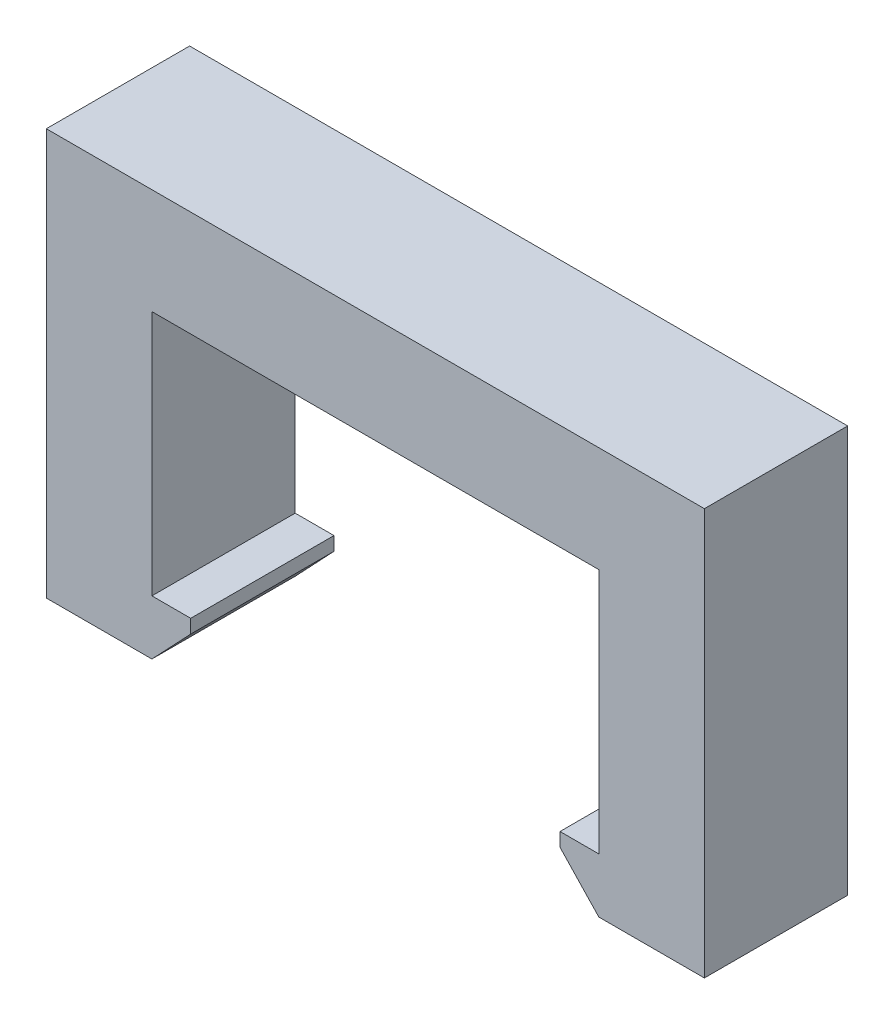
ISO-10303-21;
HEADER;
FILE_DESCRIPTION(('STEP AP214'),'2;1');
FILE_NAME('part.step','',(''),(''),'','','');
FILE_SCHEMA(('AUTOMOTIVE_DESIGN { 1 0 10303 214 1 1 1 1 }'));
ENDSEC;
DATA;
#1=APPLICATION_CONTEXT('core data for automotive mechanical design processes');
#2=APPLICATION_PROTOCOL_DEFINITION('international standard','automotive_design',2000,#1);
#3=PRODUCT_CONTEXT('',#1,'mechanical');
#4=PRODUCT('Part','Part','',(#3));
#5=PRODUCT_RELATED_PRODUCT_CATEGORY('part','',(#4));
#6=PRODUCT_DEFINITION_FORMATION('','',#4);
#7=PRODUCT_DEFINITION_CONTEXT('part definition',#1,'design');
#8=PRODUCT_DEFINITION('design','',#6,#7);
#9=PRODUCT_DEFINITION_SHAPE('','',#8);
#10=(LENGTH_UNIT() NAMED_UNIT(*) SI_UNIT(.MILLI.,.METRE.));
#11=(NAMED_UNIT(*) PLANE_ANGLE_UNIT() SI_UNIT($,.RADIAN.));
#12=(NAMED_UNIT(*) SI_UNIT($,.STERADIAN.) SOLID_ANGLE_UNIT());
#13=UNCERTAINTY_MEASURE_WITH_UNIT(LENGTH_MEASURE(1.E-05),#10,'distance_accuracy_value','');
#14=(GEOMETRIC_REPRESENTATION_CONTEXT(3) GLOBAL_UNCERTAINTY_ASSIGNED_CONTEXT((#13)) GLOBAL_UNIT_ASSIGNED_CONTEXT((#10,
#11,#12)) REPRESENTATION_CONTEXT('',''));
#15=CARTESIAN_POINT('',(0.,0.,0.));
#16=DIRECTION('',(0.,0.,1.));
#17=DIRECTION('',(1.,0.,0.));
#18=AXIS2_PLACEMENT_3D('',#15,#16,#17);
#19=CARTESIAN_POINT('',(0.,0.,12.8016));
#20=DIRECTION('',(0.,-1.,0.));
#21=DIRECTION('',(1.,0.,0.));
#22=AXIS2_PLACEMENT_3D('',#19,#20,#21);
#23=PLANE('',#22);
#24=DIRECTION('',(-1.,0.,0.));
#25=VECTOR('',#24,1.);
#26=CARTESIAN_POINT('',(0.,0.,0.));
#27=LINE('',#26,#25);
#28=CARTESIAN_POINT('',(29.3969610679769,0.,0.));
#29=VERTEX_POINT('',#28);
#30=CARTESIAN_POINT('',(-29.3969610679769,0.,0.));
#31=VERTEX_POINT('',#30);
#32=EDGE_CURVE('E107',#29,#31,#27,.T.);
#33=ORIENTED_EDGE('',*,*,#32,.T.);
#34=DIRECTION('',(0.,0.,-1.));
#35=VECTOR('',#34,1.);
#36=CARTESIAN_POINT('',(-29.3969610679769,0.,12.8016));
#37=LINE('',#36,#35);
#38=CARTESIAN_POINT('',(-29.3969610679769,0.,12.8016));
#39=VERTEX_POINT('',#38);
#40=EDGE_CURVE('E11',#39,#31,#37,.T.);
#41=ORIENTED_EDGE('',*,*,#40,.F.);
#42=DIRECTION('',(-1.,0.,0.));
#43=VECTOR('',#42,1.);
#44=CARTESIAN_POINT('',(0.,0.,12.8016));
#45=LINE('',#44,#43);
#46=CARTESIAN_POINT('',(29.3969610679769,0.,12.8016));
#47=VERTEX_POINT('',#46);
#48=EDGE_CURVE('E114',#47,#39,#45,.T.);
#49=ORIENTED_EDGE('',*,*,#48,.F.);
#50=DIRECTION('',(0.,0.,-1.));
#51=VECTOR('',#50,1.);
#52=CARTESIAN_POINT('',(29.3969610679769,0.,12.8016));
#53=LINE('',#52,#51);
#54=EDGE_CURVE('E170',#47,#29,#53,.T.);
#55=ORIENTED_EDGE('',*,*,#54,.T.);
#56=EDGE_LOOP('',(#33,#41,#49,#55));
#57=FACE_BOUND('',#56,.T.);
#58=ADVANCED_FACE('F39',(#57),#23,.F.);
#59=CARTESIAN_POINT('',(-29.3969610679769,0.,12.8016));
#60=DIRECTION('',(1.,0.,0.));
#61=DIRECTION('',(0.,1.,0.));
#62=AXIS2_PLACEMENT_3D('',#59,#60,#61);
#63=PLANE('',#62);
#64=DIRECTION('',(0.,-1.,0.));
#65=VECTOR('',#64,1.);
#66=CARTESIAN_POINT('',(-29.3969610679769,0.,0.));
#67=LINE('',#66,#65);
#68=CARTESIAN_POINT('',(-29.3969610679769,-36.3153120844734,0.));
#69=VERTEX_POINT('',#68);
#70=EDGE_CURVE('E175',#31,#69,#67,.T.);
#71=ORIENTED_EDGE('',*,*,#70,.T.);
#72=DIRECTION('',(0.,0.,-1.));
#73=VECTOR('',#72,1.);
#74=CARTESIAN_POINT('',(-29.3969610679769,-36.3153120844734,12.8016));
#75=LINE('',#74,#73);
#76=CARTESIAN_POINT('',(-29.3969610679769,-36.3153120844734,12.8016));
#77=VERTEX_POINT('',#76);
#78=EDGE_CURVE('E50',#77,#69,#75,.T.);
#79=ORIENTED_EDGE('',*,*,#78,.F.);
#80=DIRECTION('',(0.,-1.,0.));
#81=VECTOR('',#80,1.);
#82=CARTESIAN_POINT('',(-29.3969610679769,0.,12.8016));
#83=LINE('',#82,#81);
#84=EDGE_CURVE('E274',#39,#77,#83,.T.);
#85=ORIENTED_EDGE('',*,*,#84,.F.);
#86=ORIENTED_EDGE('',*,*,#40,.T.);
#87=EDGE_LOOP('',(#71,#79,#85,#86));
#88=FACE_BOUND('',#87,.T.);
#89=ADVANCED_FACE('F280',(#88),#63,.F.);
#90=CARTESIAN_POINT('',(-29.3969610679769,-36.3153120844734,12.8016));
#91=DIRECTION('',(0.,1.,0.));
#92=DIRECTION('',(0.,0.,1.));
#93=AXIS2_PLACEMENT_3D('',#90,#91,#92);
#94=PLANE('',#93);
#95=DIRECTION('',(1.,0.,0.));
#96=VECTOR('',#95,1.);
#97=CARTESIAN_POINT('',(-29.3969610679769,-36.3153120844734,0.));
#98=LINE('',#97,#96);
#99=CARTESIAN_POINT('',(-19.9644,-36.3153120844734,0.));
#100=VERTEX_POINT('',#99);
#101=EDGE_CURVE('E172',#69,#100,#98,.T.);
#102=ORIENTED_EDGE('',*,*,#101,.T.);
#103=DIRECTION('',(0.,0.,-1.));
#104=VECTOR('',#103,1.);
#105=CARTESIAN_POINT('',(-19.9644,-36.3153120844734,12.8016));
#106=LINE('',#105,#104);
#107=CARTESIAN_POINT('',(-19.9644,-36.3153120844734,12.8016));
#108=VERTEX_POINT('',#107);
#109=EDGE_CURVE('E222',#108,#100,#106,.T.);
#110=ORIENTED_EDGE('',*,*,#109,.F.);
#111=DIRECTION('',(1.,0.,0.));
#112=VECTOR('',#111,1.);
#113=CARTESIAN_POINT('',(-29.3969610679769,-36.3153120844734,12.8016));
#114=LINE('',#113,#112);
#115=EDGE_CURVE('E229',#77,#108,#114,.T.);
#116=ORIENTED_EDGE('',*,*,#115,.F.);
#117=ORIENTED_EDGE('',*,*,#78,.T.);
#118=EDGE_LOOP('',(#102,#110,#116,#117));
#119=FACE_BOUND('',#118,.T.);
#120=ADVANCED_FACE('F226',(#119),#94,.F.);
#121=CARTESIAN_POINT('',(-19.9644,-36.3153120844734,12.8016));
#122=DIRECTION('',(-0.726425661410117,0.68724504977837,0.));
#123=DIRECTION('',(-0.68724504977837,-0.726425661410117,0.));
#124=AXIS2_PLACEMENT_3D('',#121,#122,#123);
#125=PLANE('',#124);
#126=DIRECTION('',(0.68724504977837,0.726425661410117,0.));
#127=VECTOR('',#126,1.);
#128=CARTESIAN_POINT('',(-19.9644,-36.3153120844734,0.));
#129=LINE('',#128,#127);
#130=CARTESIAN_POINT('',(-16.4973,-32.650548822101,0.));
#131=VERTEX_POINT('',#130);
#132=EDGE_CURVE('E176',#100,#131,#129,.T.);
#133=ORIENTED_EDGE('',*,*,#132,.T.);
#134=DIRECTION('',(0.,0.,-1.));
#135=VECTOR('',#134,1.);
#136=CARTESIAN_POINT('',(-16.4973,-32.650548822101,12.8016));
#137=LINE('',#136,#135);
#138=CARTESIAN_POINT('',(-16.4973,-32.650548822101,12.8016));
#139=VERTEX_POINT('',#138);
#140=EDGE_CURVE('E219',#139,#131,#137,.T.);
#141=ORIENTED_EDGE('',*,*,#140,.F.);
#142=DIRECTION('',(0.68724504977837,0.726425661410117,0.));
#143=VECTOR('',#142,1.);
#144=CARTESIAN_POINT('',(-19.9644,-36.3153120844734,12.8016));
#145=LINE('',#144,#143);
#146=EDGE_CURVE('E247',#108,#139,#145,.T.);
#147=ORIENTED_EDGE('',*,*,#146,.F.);
#148=ORIENTED_EDGE('',*,*,#109,.T.);
#149=EDGE_LOOP('',(#133,#141,#147,#148));
#150=FACE_BOUND('',#149,.T.);
#151=ADVANCED_FACE('F237',(#150),#125,.F.);
#152=CARTESIAN_POINT('',(-16.4973,-32.650548822101,12.8016));
#153=DIRECTION('',(-1.,0.,0.));
#154=DIRECTION('',(0.,-1.,0.));
#155=AXIS2_PLACEMENT_3D('',#152,#153,#154);
#156=PLANE('',#155);
#157=DIRECTION('',(0.,1.,0.));
#158=VECTOR('',#157,1.);
#159=CARTESIAN_POINT('',(-16.4973,-32.650548822101,0.));
#160=LINE('',#159,#158);
#161=CARTESIAN_POINT('',(-16.4973,-31.4289610679769,0.));
#162=VERTEX_POINT('',#161);
#163=EDGE_CURVE('E178',#131,#162,#160,.T.);
#164=ORIENTED_EDGE('',*,*,#163,.T.);
#165=DIRECTION('',(0.,0.,-1.));
#166=VECTOR('',#165,1.);
#167=CARTESIAN_POINT('',(-16.4973,-31.4289610679769,12.8016));
#168=LINE('',#167,#166);
#169=CARTESIAN_POINT('',(-16.4973,-31.4289610679769,12.8016));
#170=VERTEX_POINT('',#169);
#171=EDGE_CURVE('E214',#170,#162,#168,.T.);
#172=ORIENTED_EDGE('',*,*,#171,.F.);
#173=DIRECTION('',(0.,1.,0.));
#174=VECTOR('',#173,1.);
#175=CARTESIAN_POINT('',(-16.4973,-32.650548822101,12.8016));
#176=LINE('',#175,#174);
#177=EDGE_CURVE('E244',#139,#170,#176,.T.);
#178=ORIENTED_EDGE('',*,*,#177,.F.);
#179=ORIENTED_EDGE('',*,*,#140,.T.);
#180=EDGE_LOOP('',(#164,#172,#178,#179));
#181=FACE_BOUND('',#180,.T.);
#182=ADVANCED_FACE('F243',(#181),#156,.F.);
#183=CARTESIAN_POINT('',(-16.4973,-31.4289610679769,12.8016));
#184=DIRECTION('',(0.,-1.,0.));
#185=DIRECTION('',(0.,0.,-1.));
#186=AXIS2_PLACEMENT_3D('',#183,#184,#185);
#187=PLANE('',#186);
#188=DIRECTION('',(-1.,0.,0.));
#189=VECTOR('',#188,1.);
#190=CARTESIAN_POINT('',(-16.4973,-31.4289610679769,0.));
#191=LINE('',#190,#189);
#192=CARTESIAN_POINT('',(-19.9644,-31.4289610679769,0.));
#193=VERTEX_POINT('',#192);
#194=EDGE_CURVE('E179',#162,#193,#191,.T.);
#195=ORIENTED_EDGE('',*,*,#194,.T.);
#196=DIRECTION('',(0.,0.,-1.));
#197=VECTOR('',#196,1.);
#198=CARTESIAN_POINT('',(-19.9644,-31.4289610679769,12.8016));
#199=LINE('',#198,#197);
#200=CARTESIAN_POINT('',(-19.9644,-31.4289610679769,12.8016));
#201=VERTEX_POINT('',#200);
#202=EDGE_CURVE('E215',#201,#193,#199,.T.);
#203=ORIENTED_EDGE('',*,*,#202,.F.);
#204=DIRECTION('',(-1.,0.,0.));
#205=VECTOR('',#204,1.);
#206=CARTESIAN_POINT('',(-16.4973,-31.4289610679769,12.8016));
#207=LINE('',#206,#205);
#208=EDGE_CURVE('E250',#170,#201,#207,.T.);
#209=ORIENTED_EDGE('',*,*,#208,.F.);
#210=ORIENTED_EDGE('',*,*,#171,.T.);
#211=EDGE_LOOP('',(#195,#203,#209,#210));
#212=FACE_BOUND('',#211,.T.);
#213=ADVANCED_FACE('F286',(#212),#187,.F.);
#214=CARTESIAN_POINT('',(-19.9644,-31.4289610679769,12.8016));
#215=DIRECTION('',(-1.,0.,0.));
#216=DIRECTION('',(0.,-1.,0.));
#217=AXIS2_PLACEMENT_3D('',#214,#215,#216);
#218=PLANE('',#217);
#219=DIRECTION('',(0.,1.,0.));
#220=VECTOR('',#219,1.);
#221=CARTESIAN_POINT('',(-19.9644,-31.4289610679769,0.));
#222=LINE('',#221,#220);
#223=CARTESIAN_POINT('',(-19.9644,-9.43256106797691,0.));
#224=VERTEX_POINT('',#223);
#225=EDGE_CURVE('E185',#193,#224,#222,.T.);
#226=ORIENTED_EDGE('',*,*,#225,.T.);
#227=DIRECTION('',(0.,0.,-1.));
#228=VECTOR('',#227,1.);
#229=CARTESIAN_POINT('',(-19.9644,-9.43256106797691,12.8016));
#230=LINE('',#229,#228);
#231=CARTESIAN_POINT('',(-19.9644,-9.43256106797691,12.8016));
#232=VERTEX_POINT('',#231);
#233=EDGE_CURVE('E209',#232,#224,#230,.T.);
#234=ORIENTED_EDGE('',*,*,#233,.F.);
#235=DIRECTION('',(0.,1.,0.));
#236=VECTOR('',#235,1.);
#237=CARTESIAN_POINT('',(-19.9644,-31.4289610679769,12.8016));
#238=LINE('',#237,#236);
#239=EDGE_CURVE('E249',#201,#232,#238,.T.);
#240=ORIENTED_EDGE('',*,*,#239,.F.);
#241=ORIENTED_EDGE('',*,*,#202,.T.);
#242=EDGE_LOOP('',(#226,#234,#240,#241));
#243=FACE_BOUND('',#242,.T.);
#244=ADVANCED_FACE('F292',(#243),#218,.F.);
#245=CARTESIAN_POINT('',(-19.9644,-9.43256106797691,12.8016));
#246=DIRECTION('',(0.,1.,0.));
#247=DIRECTION('',(-1.,0.,0.));
#248=AXIS2_PLACEMENT_3D('',#245,#246,#247);
#249=PLANE('',#248);
#250=DIRECTION('',(1.,0.,0.));
#251=VECTOR('',#250,1.);
#252=CARTESIAN_POINT('',(-19.9644,-9.43256106797691,0.));
#253=LINE('',#252,#251);
#254=CARTESIAN_POINT('',(19.9644,-9.43256106797691,0.));
#255=VERTEX_POINT('',#254);
#256=EDGE_CURVE('E183',#224,#255,#253,.T.);
#257=ORIENTED_EDGE('',*,*,#256,.T.);
#258=DIRECTION('',(0.,0.,-1.));
#259=VECTOR('',#258,1.);
#260=CARTESIAN_POINT('',(19.9644,-9.43256106797691,12.8016));
#261=LINE('',#260,#259);
#262=CARTESIAN_POINT('',(19.9644,-9.43256106797691,12.8016));
#263=VERTEX_POINT('',#262);
#264=EDGE_CURVE('E207',#263,#255,#261,.T.);
#265=ORIENTED_EDGE('',*,*,#264,.F.);
#266=DIRECTION('',(1.,0.,0.));
#267=VECTOR('',#266,1.);
#268=CARTESIAN_POINT('',(-19.9644,-9.43256106797691,12.8016));
#269=LINE('',#268,#267);
#270=EDGE_CURVE('E256',#232,#263,#269,.T.);
#271=ORIENTED_EDGE('',*,*,#270,.F.);
#272=ORIENTED_EDGE('',*,*,#233,.T.);
#273=EDGE_LOOP('',(#257,#265,#271,#272));
#274=FACE_BOUND('',#273,.T.);
#275=ADVANCED_FACE('F298',(#274),#249,.F.);
#276=CARTESIAN_POINT('',(19.9644,-31.4289610679769,12.8016));
#277=DIRECTION('',(1.,0.,0.));
#278=DIRECTION('',(0.,1.,0.));
#279=AXIS2_PLACEMENT_3D('',#276,#277,#278);
#280=PLANE('',#279);
#281=DIRECTION('',(0.,-1.,0.));
#282=VECTOR('',#281,1.);
#283=CARTESIAN_POINT('',(19.9644,-31.4289610679769,0.));
#284=LINE('',#283,#282);
#285=CARTESIAN_POINT('',(19.9644,-31.4289610679769,0.));
#286=VERTEX_POINT('',#285);
#287=EDGE_CURVE('E187',#255,#286,#284,.T.);
#288=ORIENTED_EDGE('',*,*,#287,.T.);
#289=DIRECTION('',(0.,0.,-1.));
#290=VECTOR('',#289,1.);
#291=CARTESIAN_POINT('',(19.9644,-31.4289610679769,12.8016));
#292=LINE('',#291,#290);
#293=CARTESIAN_POINT('',(19.9644,-31.4289610679769,12.8016));
#294=VERTEX_POINT('',#293);
#295=EDGE_CURVE('E205',#294,#286,#292,.T.);
#296=ORIENTED_EDGE('',*,*,#295,.F.);
#297=DIRECTION('',(0.,-1.,0.));
#298=VECTOR('',#297,1.);
#299=CARTESIAN_POINT('',(19.9644,-31.4289610679769,12.8016));
#300=LINE('',#299,#298);
#301=EDGE_CURVE('E257',#263,#294,#300,.T.);
#302=ORIENTED_EDGE('',*,*,#301,.F.);
#303=ORIENTED_EDGE('',*,*,#264,.T.);
#304=EDGE_LOOP('',(#288,#296,#302,#303));
#305=FACE_BOUND('',#304,.T.);
#306=ADVANCED_FACE('F297',(#305),#280,.F.);
#307=CARTESIAN_POINT('',(16.4973,-31.4289610679769,12.8016));
#308=DIRECTION('',(0.,-1.,0.));
#309=DIRECTION('',(0.,0.,-1.));
#310=AXIS2_PLACEMENT_3D('',#307,#308,#309);
#311=PLANE('',#310);
#312=DIRECTION('',(-1.,0.,0.));
#313=VECTOR('',#312,1.);
#314=CARTESIAN_POINT('',(16.4973,-31.4289610679769,0.));
#315=LINE('',#314,#313);
#316=CARTESIAN_POINT('',(16.4973,-31.4289610679769,0.));
#317=VERTEX_POINT('',#316);
#318=EDGE_CURVE('E189',#286,#317,#315,.T.);
#319=ORIENTED_EDGE('',*,*,#318,.T.);
#320=DIRECTION('',(0.,0.,-1.));
#321=VECTOR('',#320,1.);
#322=CARTESIAN_POINT('',(16.4973,-31.4289610679769,12.8016));
#323=LINE('',#322,#321);
#324=CARTESIAN_POINT('',(16.4973,-31.4289610679769,12.8016));
#325=VERTEX_POINT('',#324);
#326=EDGE_CURVE('E198',#325,#317,#323,.T.);
#327=ORIENTED_EDGE('',*,*,#326,.F.);
#328=DIRECTION('',(-1.,0.,0.));
#329=VECTOR('',#328,1.);
#330=CARTESIAN_POINT('',(16.4973,-31.4289610679769,12.8016));
#331=LINE('',#330,#329);
#332=EDGE_CURVE('E259',#294,#325,#331,.T.);
#333=ORIENTED_EDGE('',*,*,#332,.F.);
#334=ORIENTED_EDGE('',*,*,#295,.T.);
#335=EDGE_LOOP('',(#319,#327,#333,#334));
#336=FACE_BOUND('',#335,.T.);
#337=ADVANCED_FACE('F267',(#336),#311,.F.);
#338=CARTESIAN_POINT('',(16.4973,-32.650548822101,12.8016));
#339=DIRECTION('',(1.,0.,0.));
#340=DIRECTION('',(0.,1.,0.));
#341=AXIS2_PLACEMENT_3D('',#338,#339,#340);
#342=PLANE('',#341);
#343=DIRECTION('',(0.,-1.,0.));
#344=VECTOR('',#343,1.);
#345=CARTESIAN_POINT('',(16.4973,-32.650548822101,0.));
#346=LINE('',#345,#344);
#347=CARTESIAN_POINT('',(16.4973,-32.650548822101,0.));
#348=VERTEX_POINT('',#347);
#349=EDGE_CURVE('E188',#317,#348,#346,.T.);
#350=ORIENTED_EDGE('',*,*,#349,.T.);
#351=DIRECTION('',(0.,0.,-1.));
#352=VECTOR('',#351,1.);
#353=CARTESIAN_POINT('',(16.4973,-32.650548822101,12.8016));
#354=LINE('',#353,#352);
#355=CARTESIAN_POINT('',(16.4973,-32.650548822101,12.8016));
#356=VERTEX_POINT('',#355);
#357=EDGE_CURVE('E162',#356,#348,#354,.T.);
#358=ORIENTED_EDGE('',*,*,#357,.F.);
#359=DIRECTION('',(0.,-1.,0.));
#360=VECTOR('',#359,1.);
#361=CARTESIAN_POINT('',(16.4973,-32.650548822101,12.8016));
#362=LINE('',#361,#360);
#363=EDGE_CURVE('E154',#325,#356,#362,.T.);
#364=ORIENTED_EDGE('',*,*,#363,.F.);
#365=ORIENTED_EDGE('',*,*,#326,.T.);
#366=EDGE_LOOP('',(#350,#358,#364,#365));
#367=FACE_BOUND('',#366,.T.);
#368=ADVANCED_FACE('F268',(#367),#342,.F.);
#369=CARTESIAN_POINT('',(19.9644,-36.3153120844734,12.8016));
#370=DIRECTION('',(0.726425661410117,0.68724504977837,0.));
#371=DIRECTION('',(-0.68724504977837,0.726425661410117,0.));
#372=AXIS2_PLACEMENT_3D('',#369,#370,#371);
#373=PLANE('',#372);
#374=DIRECTION('',(0.68724504977837,-0.726425661410117,0.));
#375=VECTOR('',#374,1.);
#376=CARTESIAN_POINT('',(19.9644,-36.3153120844734,0.));
#377=LINE('',#376,#375);
#378=CARTESIAN_POINT('',(19.9644,-36.3153120844734,0.));
#379=VERTEX_POINT('',#378);
#380=EDGE_CURVE('E163',#348,#379,#377,.T.);
#381=ORIENTED_EDGE('',*,*,#380,.T.);
#382=DIRECTION('',(0.,0.,-1.));
#383=VECTOR('',#382,1.);
#384=CARTESIAN_POINT('',(19.9644,-36.3153120844734,12.8016));
#385=LINE('',#384,#383);
#386=CARTESIAN_POINT('',(19.9644,-36.3153120844734,12.8016));
#387=VERTEX_POINT('',#386);
#388=EDGE_CURVE('E160',#387,#379,#385,.T.);
#389=ORIENTED_EDGE('',*,*,#388,.F.);
#390=DIRECTION('',(0.68724504977837,-0.726425661410117,0.));
#391=VECTOR('',#390,1.);
#392=CARTESIAN_POINT('',(19.9644,-36.3153120844734,12.8016));
#393=LINE('',#392,#391);
#394=EDGE_CURVE('E150',#356,#387,#393,.T.);
#395=ORIENTED_EDGE('',*,*,#394,.F.);
#396=ORIENTED_EDGE('',*,*,#357,.T.);
#397=EDGE_LOOP('',(#381,#389,#395,#396));
#398=FACE_BOUND('',#397,.T.);
#399=ADVANCED_FACE('F156',(#398),#373,.F.);
#400=CARTESIAN_POINT('',(29.3969610679769,-36.3153120844734,12.8016));
#401=DIRECTION('',(0.,1.,0.));
#402=DIRECTION('',(0.,0.,1.));
#403=AXIS2_PLACEMENT_3D('',#400,#401,#402);
#404=PLANE('',#403);
#405=DIRECTION('',(1.,0.,0.));
#406=VECTOR('',#405,1.);
#407=CARTESIAN_POINT('',(29.3969610679769,-36.3153120844734,0.));
#408=LINE('',#407,#406);
#409=CARTESIAN_POINT('',(29.3969610679769,-36.3153120844734,0.));
#410=VERTEX_POINT('',#409);
#411=EDGE_CURVE('E105',#379,#410,#408,.T.);
#412=ORIENTED_EDGE('',*,*,#411,.T.);
#413=DIRECTION('',(0.,0.,-1.));
#414=VECTOR('',#413,1.);
#415=CARTESIAN_POINT('',(29.3969610679769,-36.3153120844734,12.8016));
#416=LINE('',#415,#414);
#417=CARTESIAN_POINT('',(29.3969610679769,-36.3153120844734,12.8016));
#418=VERTEX_POINT('',#417);
#419=EDGE_CURVE('E161',#418,#410,#416,.T.);
#420=ORIENTED_EDGE('',*,*,#419,.F.);
#421=DIRECTION('',(1.,0.,0.));
#422=VECTOR('',#421,1.);
#423=CARTESIAN_POINT('',(29.3969610679769,-36.3153120844734,12.8016));
#424=LINE('',#423,#422);
#425=EDGE_CURVE('E152',#387,#418,#424,.T.);
#426=ORIENTED_EDGE('',*,*,#425,.F.);
#427=ORIENTED_EDGE('',*,*,#388,.T.);
#428=EDGE_LOOP('',(#412,#420,#426,#427));
#429=FACE_BOUND('',#428,.T.);
#430=ADVANCED_FACE('F164',(#429),#404,.F.);
#431=CARTESIAN_POINT('',(29.3969610679769,0.,12.8016));
#432=DIRECTION('',(-1.,0.,0.));
#433=DIRECTION('',(0.,-1.,0.));
#434=AXIS2_PLACEMENT_3D('',#431,#432,#433);
#435=PLANE('',#434);
#436=DIRECTION('',(0.,1.,0.));
#437=VECTOR('',#436,1.);
#438=CARTESIAN_POINT('',(29.3969610679769,0.,0.));
#439=LINE('',#438,#437);
#440=EDGE_CURVE('E193',#410,#29,#439,.T.);
#441=ORIENTED_EDGE('',*,*,#440,.T.);
#442=ORIENTED_EDGE('',*,*,#54,.F.);
#443=DIRECTION('',(0.,1.,0.));
#444=VECTOR('',#443,1.);
#445=CARTESIAN_POINT('',(29.3969610679769,0.,12.8016));
#446=LINE('',#445,#444);
#447=EDGE_CURVE('E54',#418,#47,#446,.T.);
#448=ORIENTED_EDGE('',*,*,#447,.F.);
#449=ORIENTED_EDGE('',*,*,#419,.T.);
#450=EDGE_LOOP('',(#441,#442,#448,#449));
#451=FACE_BOUND('',#450,.T.);
#452=ADVANCED_FACE('F275',(#451),#435,.F.);
#453=CARTESIAN_POINT('',(0.,0.,12.8016));
#454=DIRECTION('',(0.,0.,-1.));
#455=DIRECTION('',(-1.,0.,0.));
#456=AXIS2_PLACEMENT_3D('',#453,#454,#455);
#457=PLANE('',#456);
#458=ORIENTED_EDGE('',*,*,#48,.T.);
#459=ORIENTED_EDGE('',*,*,#84,.T.);
#460=ORIENTED_EDGE('',*,*,#115,.T.);
#461=ORIENTED_EDGE('',*,*,#146,.T.);
#462=ORIENTED_EDGE('',*,*,#177,.T.);
#463=ORIENTED_EDGE('',*,*,#208,.T.);
#464=ORIENTED_EDGE('',*,*,#239,.T.);
#465=ORIENTED_EDGE('',*,*,#270,.T.);
#466=ORIENTED_EDGE('',*,*,#301,.T.);
#467=ORIENTED_EDGE('',*,*,#332,.T.);
#468=ORIENTED_EDGE('',*,*,#363,.T.);
#469=ORIENTED_EDGE('',*,*,#394,.T.);
#470=ORIENTED_EDGE('',*,*,#425,.T.);
#471=ORIENTED_EDGE('',*,*,#447,.T.);
#472=EDGE_LOOP('',(#458,#459,#460,#461,#462,#463,#464,#465,#466,#467,#468,#469,#470,#471));
#473=FACE_BOUND('',#472,.T.);
#474=ADVANCED_FACE('F148',(#473),#457,.F.);
#475=CARTESIAN_POINT('',(0.,0.,0.));
#476=DIRECTION('',(0.,0.,-1.));
#477=DIRECTION('',(-1.,0.,0.));
#478=AXIS2_PLACEMENT_3D('',#475,#476,#477);
#479=PLANE('',#478);
#480=ORIENTED_EDGE('',*,*,#32,.F.);
#481=ORIENTED_EDGE('',*,*,#440,.F.);
#482=ORIENTED_EDGE('',*,*,#411,.F.);
#483=ORIENTED_EDGE('',*,*,#380,.F.);
#484=ORIENTED_EDGE('',*,*,#349,.F.);
#485=ORIENTED_EDGE('',*,*,#318,.F.);
#486=ORIENTED_EDGE('',*,*,#287,.F.);
#487=ORIENTED_EDGE('',*,*,#256,.F.);
#488=ORIENTED_EDGE('',*,*,#225,.F.);
#489=ORIENTED_EDGE('',*,*,#194,.F.);
#490=ORIENTED_EDGE('',*,*,#163,.F.);
#491=ORIENTED_EDGE('',*,*,#132,.F.);
#492=ORIENTED_EDGE('',*,*,#101,.F.);
#493=ORIENTED_EDGE('',*,*,#70,.F.);
#494=EDGE_LOOP('',(#480,#481,#482,#483,#484,#485,#486,#487,#488,#489,#490,#491,#492,#493));
#495=FACE_BOUND('',#494,.T.);
#496=ADVANCED_FACE('F234',(#495),#479,.T.);
#497=CLOSED_SHELL('',(#58,#89,#120,#151,#182,#213,#244,#275,#306,#337,#368,#399,#430,#452,#474,#496));
#498=MANIFOLD_SOLID_BREP('B2',#497);
#499=ADVANCED_BREP_SHAPE_REPRESENTATION('',(#18,#498),#14);
#500=SHAPE_DEFINITION_REPRESENTATION(#9,#499);
ENDSEC;
END-ISO-10303-21;
